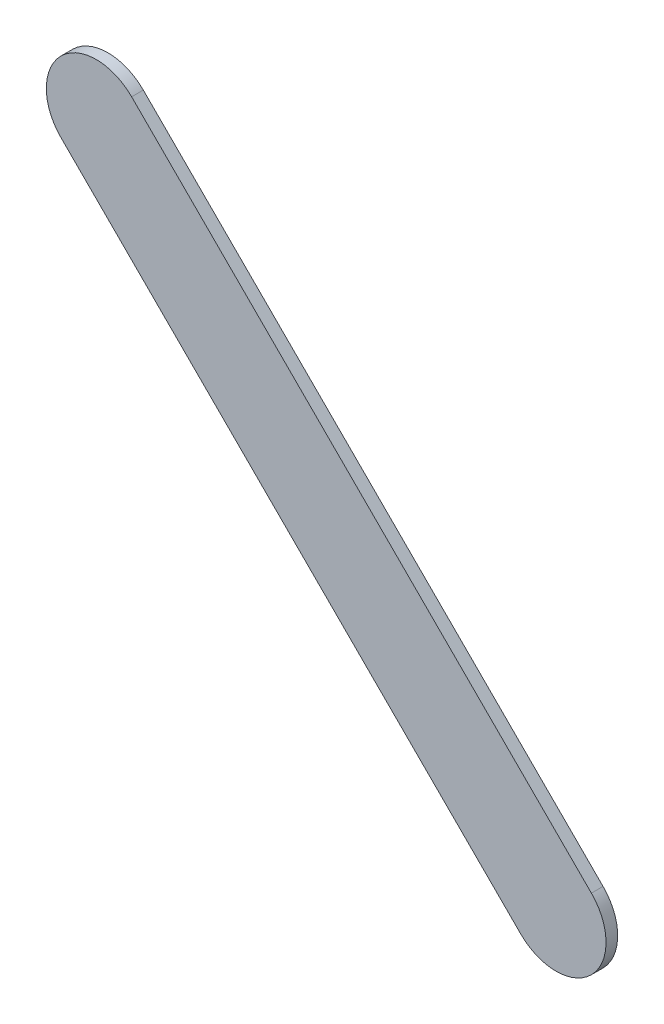
ISO-10303-21;
HEADER;
FILE_DESCRIPTION(('STEP AP214'),'2;1');
FILE_NAME('part.step','',(''),(''),'','','');
FILE_SCHEMA(('AUTOMOTIVE_DESIGN { 1 0 10303 214 1 1 1 1 }'));
ENDSEC;
DATA;
#1=APPLICATION_CONTEXT('core data for automotive mechanical design processes');
#2=APPLICATION_PROTOCOL_DEFINITION('international standard','automotive_design',2000,#1);
#3=PRODUCT_CONTEXT('',#1,'mechanical');
#4=PRODUCT('Part','Part','',(#3));
#5=PRODUCT_RELATED_PRODUCT_CATEGORY('part','',(#4));
#6=PRODUCT_DEFINITION_FORMATION('','',#4);
#7=PRODUCT_DEFINITION_CONTEXT('part definition',#1,'design');
#8=PRODUCT_DEFINITION('design','',#6,#7);
#9=PRODUCT_DEFINITION_SHAPE('','',#8);
#10=(LENGTH_UNIT() NAMED_UNIT(*) SI_UNIT(.MILLI.,.METRE.));
#11=(NAMED_UNIT(*) PLANE_ANGLE_UNIT() SI_UNIT($,.RADIAN.));
#12=(NAMED_UNIT(*) SI_UNIT($,.STERADIAN.) SOLID_ANGLE_UNIT());
#13=UNCERTAINTY_MEASURE_WITH_UNIT(LENGTH_MEASURE(1.E-05),#10,'distance_accuracy_value','');
#14=(GEOMETRIC_REPRESENTATION_CONTEXT(3) GLOBAL_UNCERTAINTY_ASSIGNED_CONTEXT((#13)) GLOBAL_UNIT_ASSIGNED_CONTEXT((#10,
#11,#12)) REPRESENTATION_CONTEXT('',''));
#15=CARTESIAN_POINT('',(0.,0.,0.));
#16=DIRECTION('',(0.,0.,1.));
#17=DIRECTION('',(1.,0.,0.));
#18=AXIS2_PLACEMENT_3D('',#15,#16,#17);
#19=CARTESIAN_POINT('',(119.016066,-64.373933,1.635));
#20=DIRECTION('',(0.,0.,1.));
#21=DIRECTION('',(1.,0.,0.));
#22=AXIS2_PLACEMENT_3D('',#19,#20,#21);
#23=PLANE('',#22);
#24=DIRECTION('',(-0.707106781186548,0.707106781186548,0.));
#25=VECTOR('',#24,1.);
#26=CARTESIAN_POINT('',(119.016066,-64.373933,1.635));
#27=LINE('',#26,#25);
#28=CARTESIAN_POINT('',(119.016066,-64.373933,1.635));
#29=VERTEX_POINT('',#28);
#30=CARTESIAN_POINT('',(117.636066,-62.993933,1.635));
#31=VERTEX_POINT('',#30);
#32=EDGE_CURVE('E93',#29,#31,#27,.T.);
#33=ORIENTED_EDGE('',*,*,#32,.T.);
#34=CARTESIAN_POINT('',(117.5299995,-63.0999995,1.635));
#35=DIRECTION('',(0.,0.,1.));
#36=DIRECTION('',(0.707106781186548,0.707106781186548,0.));
#37=AXIS2_PLACEMENT_3D('',#34,#35,#36);
#38=CIRCLE('',#37,0.150000682813);
#39=CARTESIAN_POINT('',(117.423933,-63.206066,1.635));
#40=VERTEX_POINT('',#39);
#41=EDGE_CURVE('E73',#31,#40,#38,.T.);
#42=ORIENTED_EDGE('',*,*,#41,.T.);
#43=DIRECTION('',(0.707106781186548,-0.707106781186548,0.));
#44=VECTOR('',#43,1.);
#45=CARTESIAN_POINT('',(117.423933,-63.206066,1.635));
#46=LINE('',#45,#44);
#47=CARTESIAN_POINT('',(118.803933,-64.586066,1.635));
#48=VERTEX_POINT('',#47);
#49=EDGE_CURVE('E87',#40,#48,#46,.T.);
#50=ORIENTED_EDGE('',*,*,#49,.T.);
#51=CARTESIAN_POINT('',(118.9099995,-64.4799995,1.635));
#52=DIRECTION('',(0.,0.,1.));
#53=DIRECTION('',(-0.707106781186548,-0.707106781186548,0.));
#54=AXIS2_PLACEMENT_3D('',#51,#52,#53);
#55=CIRCLE('',#54,0.150000682813);
#56=EDGE_CURVE('E11',#48,#29,#55,.T.);
#57=ORIENTED_EDGE('',*,*,#56,.T.);
#58=EDGE_LOOP('',(#33,#42,#50,#57));
#59=FACE_BOUND('',#58,.T.);
#60=ADVANCED_FACE('F17',(#59),#23,.T.);
#61=CARTESIAN_POINT('',(119.016066,-64.373933,1.6));
#62=DIRECTION('',(0.,0.,1.));
#63=DIRECTION('',(1.,0.,0.));
#64=AXIS2_PLACEMENT_3D('',#61,#62,#63);
#65=PLANE('',#64);
#66=CARTESIAN_POINT('',(118.9099995,-64.4799995,1.6));
#67=DIRECTION('',(0.,0.,1.));
#68=DIRECTION('',(-0.707106781186548,-0.707106781186548,0.));
#69=AXIS2_PLACEMENT_3D('',#66,#67,#68);
#70=CIRCLE('',#69,0.150000682813);
#71=CARTESIAN_POINT('',(118.803933,-64.586066,1.6));
#72=VERTEX_POINT('',#71);
#73=CARTESIAN_POINT('',(119.016066,-64.373933,1.6));
#74=VERTEX_POINT('',#73);
#75=EDGE_CURVE('E20',#72,#74,#70,.T.);
#76=ORIENTED_EDGE('',*,*,#75,.F.);
#77=DIRECTION('',(0.707106781186548,-0.707106781186548,0.));
#78=VECTOR('',#77,1.);
#79=CARTESIAN_POINT('',(117.423933,-63.206066,1.6));
#80=LINE('',#79,#78);
#81=CARTESIAN_POINT('',(117.423933,-63.206066,1.6));
#82=VERTEX_POINT('',#81);
#83=EDGE_CURVE('E58',#82,#72,#80,.T.);
#84=ORIENTED_EDGE('',*,*,#83,.F.);
#85=CARTESIAN_POINT('',(117.5299995,-63.0999995,1.6));
#86=DIRECTION('',(0.,0.,1.));
#87=DIRECTION('',(0.707106781186548,0.707106781186548,0.));
#88=AXIS2_PLACEMENT_3D('',#85,#86,#87);
#89=CIRCLE('',#88,0.150000682813);
#90=CARTESIAN_POINT('',(117.636066,-62.993933,1.6));
#91=VERTEX_POINT('',#90);
#92=EDGE_CURVE('E95',#91,#82,#89,.T.);
#93=ORIENTED_EDGE('',*,*,#92,.F.);
#94=DIRECTION('',(-0.707106781186548,0.707106781186548,0.));
#95=VECTOR('',#94,1.);
#96=CARTESIAN_POINT('',(119.016066,-64.373933,1.6));
#97=LINE('',#96,#95);
#98=EDGE_CURVE('E92',#74,#91,#97,.T.);
#99=ORIENTED_EDGE('',*,*,#98,.F.);
#100=EDGE_LOOP('',(#76,#84,#93,#99));
#101=FACE_BOUND('',#100,.T.);
#102=ADVANCED_FACE('F97',(#101),#65,.F.);
#103=CARTESIAN_POINT('',(118.9099995,-64.4799995,1.6));
#104=DIRECTION('',(0.,0.,-1.));
#105=DIRECTION('',(-0.707106781186548,-0.707106781186548,0.));
#106=AXIS2_PLACEMENT_3D('',#103,#104,#105);
#107=CYLINDRICAL_SURFACE('',#106,0.150000682813);
#108=ORIENTED_EDGE('',*,*,#75,.T.);
#109=DIRECTION('',(0.,0.,1.));
#110=VECTOR('',#109,1.);
#111=CARTESIAN_POINT('',(119.016066,-64.373933,1.6));
#112=LINE('',#111,#110);
#113=EDGE_CURVE('E82',#74,#29,#112,.T.);
#114=ORIENTED_EDGE('',*,*,#113,.T.);
#115=ORIENTED_EDGE('',*,*,#56,.F.);
#116=DIRECTION('',(0.,0.,1.));
#117=VECTOR('',#116,1.);
#118=CARTESIAN_POINT('',(118.803933,-64.586066,1.6));
#119=LINE('',#118,#117);
#120=EDGE_CURVE('E85',#72,#48,#119,.T.);
#121=ORIENTED_EDGE('',*,*,#120,.F.);
#122=EDGE_LOOP('',(#108,#114,#115,#121));
#123=FACE_BOUND('',#122,.T.);
#124=ADVANCED_FACE('F81',(#123),#107,.T.);
#125=CARTESIAN_POINT('',(117.423933,-63.206066,1.6));
#126=DIRECTION('',(0.707106781186548,0.707106781186548,0.));
#127=DIRECTION('',(0.,0.,-1.));
#128=AXIS2_PLACEMENT_3D('',#125,#126,#127);
#129=PLANE('',#128);
#130=ORIENTED_EDGE('',*,*,#83,.T.);
#131=ORIENTED_EDGE('',*,*,#120,.T.);
#132=ORIENTED_EDGE('',*,*,#49,.F.);
#133=DIRECTION('',(0.,0.,1.));
#134=VECTOR('',#133,1.);
#135=CARTESIAN_POINT('',(117.423933,-63.206066,1.6));
#136=LINE('',#135,#134);
#137=EDGE_CURVE('E110',#82,#40,#136,.T.);
#138=ORIENTED_EDGE('',*,*,#137,.F.);
#139=EDGE_LOOP('',(#130,#131,#132,#138));
#140=FACE_BOUND('',#139,.T.);
#141=ADVANCED_FACE('F124',(#140),#129,.F.);
#142=CARTESIAN_POINT('',(117.5299995,-63.0999995,1.6));
#143=DIRECTION('',(0.,0.,-1.));
#144=DIRECTION('',(0.707106781186548,0.707106781186548,0.));
#145=AXIS2_PLACEMENT_3D('',#142,#143,#144);
#146=CYLINDRICAL_SURFACE('',#145,0.150000682813);
#147=ORIENTED_EDGE('',*,*,#92,.T.);
#148=ORIENTED_EDGE('',*,*,#137,.T.);
#149=ORIENTED_EDGE('',*,*,#41,.F.);
#150=DIRECTION('',(0.,0.,1.));
#151=VECTOR('',#150,1.);
#152=CARTESIAN_POINT('',(117.636066,-62.993933,1.6));
#153=LINE('',#152,#151);
#154=EDGE_CURVE('E100',#91,#31,#153,.T.);
#155=ORIENTED_EDGE('',*,*,#154,.F.);
#156=EDGE_LOOP('',(#147,#148,#149,#155));
#157=FACE_BOUND('',#156,.T.);
#158=ADVANCED_FACE('F125',(#157),#146,.T.);
#159=CARTESIAN_POINT('',(119.016066,-64.373933,1.6));
#160=DIRECTION('',(-0.707106781186548,-0.707106781186548,0.));
#161=DIRECTION('',(-0.707106781186548,0.707106781186548,0.));
#162=AXIS2_PLACEMENT_3D('',#159,#160,#161);
#163=PLANE('',#162);
#164=ORIENTED_EDGE('',*,*,#98,.T.);
#165=ORIENTED_EDGE('',*,*,#154,.T.);
#166=ORIENTED_EDGE('',*,*,#32,.F.);
#167=ORIENTED_EDGE('',*,*,#113,.F.);
#168=EDGE_LOOP('',(#164,#165,#166,#167));
#169=FACE_BOUND('',#168,.T.);
#170=ADVANCED_FACE('F90',(#169),#163,.F.);
#171=CLOSED_SHELL('',(#60,#102,#124,#141,#158,#170));
#172=MANIFOLD_SOLID_BREP('B1',#171);
#173=ADVANCED_BREP_SHAPE_REPRESENTATION('',(#18,#172),#14);
#174=SHAPE_DEFINITION_REPRESENTATION(#9,#173);
ENDSEC;
END-ISO-10303-21;
